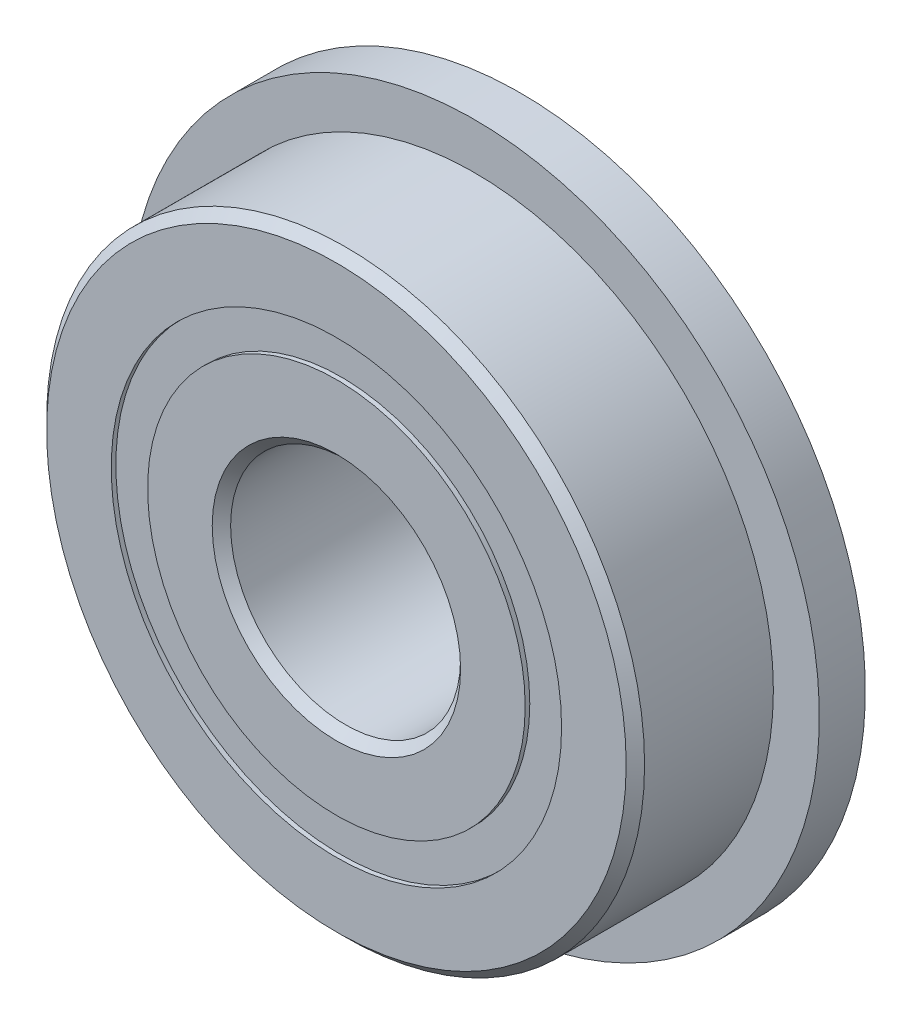
ISO-10303-21;
HEADER;
FILE_DESCRIPTION(('STEP AP214'),'2;1');
FILE_NAME('part.step','',(''),(''),'','','');
FILE_SCHEMA(('AUTOMOTIVE_DESIGN { 1 0 10303 214 1 1 1 1 }'));
ENDSEC;
DATA;
#1=APPLICATION_CONTEXT('core data for automotive mechanical design processes');
#2=APPLICATION_PROTOCOL_DEFINITION('international standard','automotive_design',2000,#1);
#3=PRODUCT_CONTEXT('',#1,'mechanical');
#4=PRODUCT('Part','Part','',(#3));
#5=PRODUCT_RELATED_PRODUCT_CATEGORY('part','',(#4));
#6=PRODUCT_DEFINITION_FORMATION('','',#4);
#7=PRODUCT_DEFINITION_CONTEXT('part definition',#1,'design');
#8=PRODUCT_DEFINITION('design','',#6,#7);
#9=PRODUCT_DEFINITION_SHAPE('','',#8);
#10=(LENGTH_UNIT() NAMED_UNIT(*) SI_UNIT(.MILLI.,.METRE.));
#11=(NAMED_UNIT(*) PLANE_ANGLE_UNIT() SI_UNIT($,.RADIAN.));
#12=(NAMED_UNIT(*) SI_UNIT($,.STERADIAN.) SOLID_ANGLE_UNIT());
#13=UNCERTAINTY_MEASURE_WITH_UNIT(LENGTH_MEASURE(1.E-05),#10,'distance_accuracy_value','');
#14=(GEOMETRIC_REPRESENTATION_CONTEXT(3) GLOBAL_UNCERTAINTY_ASSIGNED_CONTEXT((#13)) GLOBAL_UNIT_ASSIGNED_CONTEXT((#10,
#11,#12)) REPRESENTATION_CONTEXT('',''));
#15=CARTESIAN_POINT('',(0.,0.,0.));
#16=DIRECTION('',(0.,0.,1.));
#17=DIRECTION('',(1.,0.,0.));
#18=AXIS2_PLACEMENT_3D('',#15,#16,#17);
#19=CARTESIAN_POINT('',(0.,4.89560439560439,-1.9));
#20=DIRECTION('',(0.,0.,1.));
#21=DIRECTION('',(1.,0.,0.));
#22=AXIS2_PLACEMENT_3D('',#19,#20,#21);
#23=PLANE('',#22);
#24=CARTESIAN_POINT('',(0.,0.,-1.9));
#25=DIRECTION('',(0.,0.,1.));
#26=DIRECTION('',(1.,0.,0.));
#27=AXIS2_PLACEMENT_3D('',#24,#25,#26);
#28=CIRCLE('',#27,4.89560439560439);
#29=CARTESIAN_POINT('',(4.89560439560439,0.,-1.9));
#30=VERTEX_POINT('',#29);
#31=EDGE_CURVE('E57',#30,#30,#28,.T.);
#32=ORIENTED_EDGE('',*,*,#31,.F.);
#33=EDGE_LOOP('',(#32));
#34=FACE_BOUND('',#33,.T.);
#35=CARTESIAN_POINT('',(0.,0.,-1.9));
#36=DIRECTION('',(0.,0.,1.));
#37=DIRECTION('',(1.,0.,0.));
#38=AXIS2_PLACEMENT_3D('',#35,#36,#37);
#39=CIRCLE('',#38,4.1043956043956);
#40=CARTESIAN_POINT('',(4.1043956043956,0.,-1.9));
#41=VERTEX_POINT('',#40);
#42=EDGE_CURVE('E11',#41,#41,#39,.T.);
#43=ORIENTED_EDGE('',*,*,#42,.T.);
#44=EDGE_LOOP('',(#43));
#45=FACE_BOUND('',#44,.T.);
#46=ADVANCED_FACE('F43',(#34,#45),#23,.F.);
#47=CARTESIAN_POINT('',(0.,0.,2.));
#48=DIRECTION('',(0.,0.,1.));
#49=DIRECTION('',(1.,0.,0.));
#50=AXIS2_PLACEMENT_3D('',#47,#48,#49);
#51=CYLINDRICAL_SURFACE('',#50,4.1043956043956);
#52=ORIENTED_EDGE('',*,*,#42,.F.);
#53=EDGE_LOOP('',(#52));
#54=FACE_BOUND('',#53,.T.);
#55=CARTESIAN_POINT('',(0.,0.,-0.972947220876673));
#56=DIRECTION('',(0.,0.,1.));
#57=DIRECTION('',(1.,0.,0.));
#58=AXIS2_PLACEMENT_3D('',#55,#56,#57);
#59=CIRCLE('',#58,4.1043956043956);
#60=CARTESIAN_POINT('',(4.1043956043956,0.,-0.972947220876673));
#61=VERTEX_POINT('',#60);
#62=EDGE_CURVE('E49',#61,#61,#59,.T.);
#63=ORIENTED_EDGE('',*,*,#62,.T.);
#64=EDGE_LOOP('',(#63));
#65=FACE_BOUND('',#64,.T.);
#66=ADVANCED_FACE('F66',(#54,#65),#51,.F.);
#67=CARTESIAN_POINT('',(0.,4.8956043956044,-0.972947220876673));
#68=DIRECTION('',(0.,0.,-1.));
#69=DIRECTION('',(-1.,0.,0.));
#70=AXIS2_PLACEMENT_3D('',#67,#68,#69);
#71=PLANE('',#70);
#72=ORIENTED_EDGE('',*,*,#62,.F.);
#73=EDGE_LOOP('',(#72));
#74=FACE_BOUND('',#73,.T.);
#75=CARTESIAN_POINT('',(0.,0.,-0.972947220876673));
#76=DIRECTION('',(0.,0.,1.));
#77=DIRECTION('',(1.,0.,0.));
#78=AXIS2_PLACEMENT_3D('',#75,#76,#77);
#79=CIRCLE('',#78,4.8956043956044);
#80=CARTESIAN_POINT('',(4.8956043956044,0.,-0.972947220876673));
#81=VERTEX_POINT('',#80);
#82=EDGE_CURVE('E53',#81,#81,#79,.T.);
#83=ORIENTED_EDGE('',*,*,#82,.T.);
#84=EDGE_LOOP('',(#83));
#85=FACE_BOUND('',#84,.T.);
#86=ADVANCED_FACE('F70',(#74,#85),#71,.F.);
#87=CARTESIAN_POINT('',(0.,0.,2.));
#88=DIRECTION('',(0.,0.,1.));
#89=DIRECTION('',(1.,0.,0.));
#90=AXIS2_PLACEMENT_3D('',#87,#88,#89);
#91=CYLINDRICAL_SURFACE('',#90,4.89560439560439);
#92=ORIENTED_EDGE('',*,*,#82,.F.);
#93=EDGE_LOOP('',(#92));
#94=FACE_BOUND('',#93,.T.);
#95=ORIENTED_EDGE('',*,*,#31,.T.);
#96=EDGE_LOOP('',(#95));
#97=FACE_BOUND('',#96,.T.);
#98=ADVANCED_FACE('F63',(#94,#97),#91,.T.);
#99=CLOSED_SHELL('',(#46,#66,#86,#98));
#100=MANIFOLD_SOLID_BREP('B2',#99);
#101=CARTESIAN_POINT('',(0.,4.89560439560439,1.9));
#102=DIRECTION('',(0.,0.,-1.));
#103=DIRECTION('',(-1.,0.,0.));
#104=AXIS2_PLACEMENT_3D('',#101,#102,#103);
#105=PLANE('',#104);
#106=CARTESIAN_POINT('',(0.,0.,1.9));
#107=DIRECTION('',(0.,0.,1.));
#108=DIRECTION('',(1.,0.,0.));
#109=AXIS2_PLACEMENT_3D('',#106,#107,#108);
#110=CIRCLE('',#109,4.1043956043956);
#111=CARTESIAN_POINT('',(4.1043956043956,0.,1.9));
#112=VERTEX_POINT('',#111);
#113=EDGE_CURVE('E42',#112,#112,#110,.T.);
#114=ORIENTED_EDGE('',*,*,#113,.F.);
#115=EDGE_LOOP('',(#114));
#116=FACE_BOUND('',#115,.T.);
#117=CARTESIAN_POINT('',(0.,0.,1.9));
#118=DIRECTION('',(0.,0.,1.));
#119=DIRECTION('',(1.,0.,0.));
#120=AXIS2_PLACEMENT_3D('',#117,#118,#119);
#121=CIRCLE('',#120,4.89560439560439);
#122=CARTESIAN_POINT('',(4.89560439560439,0.,1.9));
#123=VERTEX_POINT('',#122);
#124=EDGE_CURVE('E126',#123,#123,#121,.T.);
#125=ORIENTED_EDGE('',*,*,#124,.T.);
#126=EDGE_LOOP('',(#125));
#127=FACE_BOUND('',#126,.T.);
#128=ADVANCED_FACE('F112',(#116,#127),#105,.F.);
#129=CARTESIAN_POINT('',(0.,0.,2.));
#130=DIRECTION('',(0.,0.,1.));
#131=DIRECTION('',(1.,0.,0.));
#132=AXIS2_PLACEMENT_3D('',#129,#130,#131);
#133=CYLINDRICAL_SURFACE('',#132,4.1043956043956);
#134=CARTESIAN_POINT('',(0.,0.,0.972947220876673));
#135=DIRECTION('',(0.,0.,1.));
#136=DIRECTION('',(1.,0.,0.));
#137=AXIS2_PLACEMENT_3D('',#134,#135,#136);
#138=CIRCLE('',#137,4.1043956043956);
#139=CARTESIAN_POINT('',(4.1043956043956,0.,0.972947220876673));
#140=VERTEX_POINT('',#139);
#141=EDGE_CURVE('E118',#140,#140,#138,.T.);
#142=ORIENTED_EDGE('',*,*,#141,.F.);
#143=EDGE_LOOP('',(#142));
#144=FACE_BOUND('',#143,.T.);
#145=ORIENTED_EDGE('',*,*,#113,.T.);
#146=EDGE_LOOP('',(#145));
#147=FACE_BOUND('',#146,.T.);
#148=ADVANCED_FACE('F141',(#144,#147),#133,.F.);
#149=CARTESIAN_POINT('',(0.,4.89560439560439,0.972947220876673));
#150=DIRECTION('',(0.,0.,1.));
#151=DIRECTION('',(1.,0.,0.));
#152=AXIS2_PLACEMENT_3D('',#149,#150,#151);
#153=PLANE('',#152);
#154=CARTESIAN_POINT('',(0.,0.,0.972947220876673));
#155=DIRECTION('',(0.,0.,1.));
#156=DIRECTION('',(1.,0.,0.));
#157=AXIS2_PLACEMENT_3D('',#154,#155,#156);
#158=CIRCLE('',#157,4.89560439560439);
#159=CARTESIAN_POINT('',(4.89560439560439,0.,0.972947220876673));
#160=VERTEX_POINT('',#159);
#161=EDGE_CURVE('E122',#160,#160,#158,.T.);
#162=ORIENTED_EDGE('',*,*,#161,.F.);
#163=EDGE_LOOP('',(#162));
#164=FACE_BOUND('',#163,.T.);
#165=ORIENTED_EDGE('',*,*,#141,.T.);
#166=EDGE_LOOP('',(#165));
#167=FACE_BOUND('',#166,.T.);
#168=ADVANCED_FACE('F136',(#164,#167),#153,.F.);
#169=CARTESIAN_POINT('',(0.,0.,2.));
#170=DIRECTION('',(0.,0.,1.));
#171=DIRECTION('',(1.,0.,0.));
#172=AXIS2_PLACEMENT_3D('',#169,#170,#171);
#173=CYLINDRICAL_SURFACE('',#172,4.89560439560439);
#174=ORIENTED_EDGE('',*,*,#124,.F.);
#175=EDGE_LOOP('',(#174));
#176=FACE_BOUND('',#175,.T.);
#177=ORIENTED_EDGE('',*,*,#161,.T.);
#178=EDGE_LOOP('',(#177));
#179=FACE_BOUND('',#178,.T.);
#180=ADVANCED_FACE('F133',(#176,#179),#173,.T.);
#181=CLOSED_SHELL('',(#128,#148,#168,#180));
#182=MANIFOLD_SOLID_BREP('B6',#181);
#183=CARTESIAN_POINT('',(0.,4.1043956043956,2.));
#184=DIRECTION('',(0.,0.,-1.));
#185=DIRECTION('',(-1.,0.,0.));
#186=AXIS2_PLACEMENT_3D('',#183,#184,#185);
#187=PLANE('',#186);
#188=CARTESIAN_POINT('',(0.,0.,2.));
#189=DIRECTION('',(0.,0.,1.));
#190=DIRECTION('',(1.,0.,0.));
#191=AXIS2_PLACEMENT_3D('',#188,#189,#190);
#192=CIRCLE('',#191,2.7);
#193=CARTESIAN_POINT('',(2.7,0.,2.));
#194=VERTEX_POINT('',#193);
#195=EDGE_CURVE('E208',#194,#194,#192,.T.);
#196=ORIENTED_EDGE('',*,*,#195,.F.);
#197=EDGE_LOOP('',(#196));
#198=FACE_BOUND('',#197,.T.);
#199=CARTESIAN_POINT('',(0.,0.,2.));
#200=DIRECTION('',(0.,0.,1.));
#201=DIRECTION('',(1.,0.,0.));
#202=AXIS2_PLACEMENT_3D('',#199,#200,#201);
#203=CIRCLE('',#202,4.1043956043956);
#204=CARTESIAN_POINT('',(4.1043956043956,0.,2.));
#205=VERTEX_POINT('',#204);
#206=EDGE_CURVE('E111',#205,#205,#203,.T.);
#207=ORIENTED_EDGE('',*,*,#206,.T.);
#208=EDGE_LOOP('',(#207));
#209=FACE_BOUND('',#208,.T.);
#210=ADVANCED_FACE('F180',(#198,#209),#187,.F.);
#211=CARTESIAN_POINT('',(0.,0.,2.));
#212=DIRECTION('',(0.,0.,1.));
#213=DIRECTION('',(1.,0.,0.));
#214=AXIS2_PLACEMENT_3D('',#211,#212,#213);
#215=CYLINDRICAL_SURFACE('',#214,4.1043956043956);
#216=ORIENTED_EDGE('',*,*,#206,.F.);
#217=EDGE_LOOP('',(#216));
#218=FACE_BOUND('',#217,.T.);
#219=CARTESIAN_POINT('',(0.,0.,0.888888888888888));
#220=DIRECTION('',(0.,0.,1.));
#221=DIRECTION('',(1.,0.,0.));
#222=AXIS2_PLACEMENT_3D('',#219,#220,#221);
#223=CIRCLE('',#222,4.1043956043956);
#224=CARTESIAN_POINT('',(4.1043956043956,0.,0.888888888888888));
#225=VERTEX_POINT('',#224);
#226=EDGE_CURVE('E186',#225,#225,#223,.T.);
#227=ORIENTED_EDGE('',*,*,#226,.T.);
#228=EDGE_LOOP('',(#227));
#229=FACE_BOUND('',#228,.T.);
#230=ADVANCED_FACE('F215',(#218,#229),#215,.T.);
#231=CARTESIAN_POINT('',(0.,0.,0.));
#232=DIRECTION('',(0.,0.,1.));
#233=DIRECTION('',(1.,0.,0.));
#234=AXIS2_PLACEMENT_3D('',#231,#232,#233);
#235=TOROIDAL_SURFACE('',#234,4.5,0.972947220876672);
#236=ORIENTED_EDGE('',*,*,#226,.F.);
#237=EDGE_LOOP('',(#236));
#238=FACE_BOUND('',#237,.T.);
#239=CARTESIAN_POINT('',(0.,0.,-0.88888888888889));
#240=DIRECTION('',(0.,0.,1.));
#241=DIRECTION('',(1.,0.,0.));
#242=AXIS2_PLACEMENT_3D('',#239,#240,#241);
#243=CIRCLE('',#242,4.1043956043956);
#244=CARTESIAN_POINT('',(4.1043956043956,0.,-0.88888888888889));
#245=VERTEX_POINT('',#244);
#246=EDGE_CURVE('E190',#245,#245,#243,.T.);
#247=ORIENTED_EDGE('',*,*,#246,.T.);
#248=EDGE_LOOP('',(#247));
#249=FACE_BOUND('',#248,.T.);
#250=ADVANCED_FACE('F219',(#238,#249),#235,.F.);
#251=CARTESIAN_POINT('',(0.,0.,2.));
#252=DIRECTION('',(0.,0.,1.));
#253=DIRECTION('',(1.,0.,0.));
#254=AXIS2_PLACEMENT_3D('',#251,#252,#253);
#255=CYLINDRICAL_SURFACE('',#254,4.1043956043956);
#256=ORIENTED_EDGE('',*,*,#246,.F.);
#257=EDGE_LOOP('',(#256));
#258=FACE_BOUND('',#257,.T.);
#259=CARTESIAN_POINT('',(0.,0.,-2.));
#260=DIRECTION('',(0.,0.,1.));
#261=DIRECTION('',(1.,0.,0.));
#262=AXIS2_PLACEMENT_3D('',#259,#260,#261);
#263=CIRCLE('',#262,4.1043956043956);
#264=CARTESIAN_POINT('',(4.1043956043956,0.,-2.));
#265=VERTEX_POINT('',#264);
#266=EDGE_CURVE('E194',#265,#265,#263,.T.);
#267=ORIENTED_EDGE('',*,*,#266,.T.);
#268=EDGE_LOOP('',(#267));
#269=FACE_BOUND('',#268,.T.);
#270=ADVANCED_FACE('F224',(#258,#269),#255,.T.);
#271=CARTESIAN_POINT('',(0.,2.7,-2.));
#272=DIRECTION('',(0.,0.,1.));
#273=DIRECTION('',(1.,0.,0.));
#274=AXIS2_PLACEMENT_3D('',#271,#272,#273);
#275=PLANE('',#274);
#276=ORIENTED_EDGE('',*,*,#266,.F.);
#277=EDGE_LOOP('',(#276));
#278=FACE_BOUND('',#277,.T.);
#279=CARTESIAN_POINT('',(0.,0.,-2.));
#280=DIRECTION('',(0.,0.,1.));
#281=DIRECTION('',(1.,0.,0.));
#282=AXIS2_PLACEMENT_3D('',#279,#280,#281);
#283=CIRCLE('',#282,2.7);
#284=CARTESIAN_POINT('',(2.7,0.,-2.));
#285=VERTEX_POINT('',#284);
#286=EDGE_CURVE('E199',#285,#285,#283,.T.);
#287=ORIENTED_EDGE('',*,*,#286,.T.);
#288=EDGE_LOOP('',(#287));
#289=FACE_BOUND('',#288,.T.);
#290=ADVANCED_FACE('F230',(#278,#289),#275,.F.);
#291=CARTESIAN_POINT('',(0.,0.,-1.8));
#292=DIRECTION('',(0.,0.,-1.));
#293=DIRECTION('',(-1.,0.,0.));
#294=AXIS2_PLACEMENT_3D('',#291,#292,#293);
#295=CONICAL_SURFACE('',#294,2.5,0.785398163397447);
#296=ORIENTED_EDGE('',*,*,#286,.F.);
#297=EDGE_LOOP('',(#296));
#298=FACE_BOUND('',#297,.T.);
#299=CARTESIAN_POINT('',(0.,0.,-1.8));
#300=DIRECTION('',(0.,0.,1.));
#301=DIRECTION('',(1.,0.,0.));
#302=AXIS2_PLACEMENT_3D('',#299,#300,#301);
#303=CIRCLE('',#302,2.5);
#304=CARTESIAN_POINT('',(2.5,0.,-1.8));
#305=VERTEX_POINT('',#304);
#306=EDGE_CURVE('E202',#305,#305,#303,.T.);
#307=ORIENTED_EDGE('',*,*,#306,.T.);
#308=EDGE_LOOP('',(#307));
#309=FACE_BOUND('',#308,.T.);
#310=ADVANCED_FACE('F234',(#298,#309),#295,.F.);
#311=CARTESIAN_POINT('',(0.,0.,2.));
#312=DIRECTION('',(0.,0.,1.));
#313=DIRECTION('',(1.,0.,0.));
#314=AXIS2_PLACEMENT_3D('',#311,#312,#313);
#315=CYLINDRICAL_SURFACE('',#314,2.5);
#316=ORIENTED_EDGE('',*,*,#306,.F.);
#317=EDGE_LOOP('',(#316));
#318=FACE_BOUND('',#317,.T.);
#319=CARTESIAN_POINT('',(0.,0.,1.8));
#320=DIRECTION('',(0.,0.,1.));
#321=DIRECTION('',(1.,0.,0.));
#322=AXIS2_PLACEMENT_3D('',#319,#320,#321);
#323=CIRCLE('',#322,2.5);
#324=CARTESIAN_POINT('',(2.5,0.,1.8));
#325=VERTEX_POINT('',#324);
#326=EDGE_CURVE('E205',#325,#325,#323,.T.);
#327=ORIENTED_EDGE('',*,*,#326,.T.);
#328=EDGE_LOOP('',(#327));
#329=FACE_BOUND('',#328,.T.);
#330=ADVANCED_FACE('F238',(#318,#329),#315,.F.);
#331=CARTESIAN_POINT('',(0.,0.,2.));
#332=DIRECTION('',(0.,0.,1.));
#333=DIRECTION('',(1.,0.,0.));
#334=AXIS2_PLACEMENT_3D('',#331,#332,#333);
#335=CONICAL_SURFACE('',#334,2.7,0.785398163397447);
#336=ORIENTED_EDGE('',*,*,#326,.F.);
#337=EDGE_LOOP('',(#336));
#338=FACE_BOUND('',#337,.T.);
#339=ORIENTED_EDGE('',*,*,#195,.T.);
#340=EDGE_LOOP('',(#339));
#341=FACE_BOUND('',#340,.T.);
#342=ADVANCED_FACE('F212',(#338,#341),#335,.F.);
#343=CLOSED_SHELL('',(#210,#230,#250,#270,#290,#310,#330,#342));
#344=MANIFOLD_SOLID_BREP('B37',#343);
#345=CARTESIAN_POINT('',(0.,0.,1.8));
#346=DIRECTION('',(0.,0.,-1.));
#347=DIRECTION('',(-1.,0.,0.));
#348=AXIS2_PLACEMENT_3D('',#345,#346,#347);
#349=CONICAL_SURFACE('',#348,6.5,0.785398163397448);
#350=CARTESIAN_POINT('',(0.,0.,2.));
#351=DIRECTION('',(0.,0.,1.));
#352=DIRECTION('',(1.,0.,0.));
#353=AXIS2_PLACEMENT_3D('',#350,#351,#352);
#354=CIRCLE('',#353,6.3);
#355=CARTESIAN_POINT('',(6.3,0.,2.));
#356=VERTEX_POINT('',#355);
#357=EDGE_CURVE('E323',#356,#356,#354,.T.);
#358=ORIENTED_EDGE('',*,*,#357,.F.);
#359=EDGE_LOOP('',(#358));
#360=FACE_BOUND('',#359,.T.);
#361=CARTESIAN_POINT('',(0.,0.,1.8));
#362=DIRECTION('',(0.,0.,1.));
#363=DIRECTION('',(1.,0.,0.));
#364=AXIS2_PLACEMENT_3D('',#361,#362,#363);
#365=CIRCLE('',#364,6.5);
#366=CARTESIAN_POINT('',(6.5,0.,1.8));
#367=VERTEX_POINT('',#366);
#368=EDGE_CURVE('E179',#367,#367,#365,.T.);
#369=ORIENTED_EDGE('',*,*,#368,.T.);
#370=EDGE_LOOP('',(#369));
#371=FACE_BOUND('',#370,.T.);
#372=ADVANCED_FACE('F301',(#360,#371),#349,.T.);
#373=CARTESIAN_POINT('',(0.,0.,2.));
#374=DIRECTION('',(0.,0.,1.));
#375=DIRECTION('',(1.,0.,0.));
#376=AXIS2_PLACEMENT_3D('',#373,#374,#375);
#377=CYLINDRICAL_SURFACE('',#376,6.5);
#378=CARTESIAN_POINT('',(0.,0.,-1.));
#379=DIRECTION('',(0.,0.,1.));
#380=DIRECTION('',(1.,0.,0.));
#381=AXIS2_PLACEMENT_3D('',#378,#379,#380);
#382=CIRCLE('',#381,6.5);
#383=CARTESIAN_POINT('',(6.5,0.,-1.));
#384=VERTEX_POINT('',#383);
#385=EDGE_CURVE('E326',#384,#384,#382,.T.);
#386=ORIENTED_EDGE('',*,*,#385,.T.);
#387=EDGE_LOOP('',(#386));
#388=FACE_BOUND('',#387,.T.);
#389=ORIENTED_EDGE('',*,*,#368,.F.);
#390=EDGE_LOOP('',(#389));
#391=FACE_BOUND('',#390,.T.);
#392=ADVANCED_FACE('F346',(#388,#391),#377,.T.);
#393=CARTESIAN_POINT('',(0.,6.3,-2.));
#394=DIRECTION('',(0.,0.,1.));
#395=DIRECTION('',(1.,0.,0.));
#396=AXIS2_PLACEMENT_3D('',#393,#394,#395);
#397=PLANE('',#396);
#398=CARTESIAN_POINT('',(0.,0.,-2.));
#399=DIRECTION('',(0.,0.,1.));
#400=DIRECTION('',(1.,0.,0.));
#401=AXIS2_PLACEMENT_3D('',#398,#399,#400);
#402=CIRCLE('',#401,4.8956043956044);
#403=CARTESIAN_POINT('',(4.8956043956044,0.,-2.));
#404=VERTEX_POINT('',#403);
#405=EDGE_CURVE('E307',#404,#404,#402,.T.);
#406=ORIENTED_EDGE('',*,*,#405,.T.);
#407=EDGE_LOOP('',(#406));
#408=FACE_BOUND('',#407,.T.);
#409=CARTESIAN_POINT('',(0.,0.,-2.));
#410=DIRECTION('',(0.,0.,-1.));
#411=DIRECTION('',(-1.,0.,0.));
#412=AXIS2_PLACEMENT_3D('',#409,#410,#411);
#413=CIRCLE('',#412,7.5);
#414=CARTESIAN_POINT('',(-7.5,0.,-2.));
#415=VERTEX_POINT('',#414);
#416=EDGE_CURVE('E329',#415,#415,#413,.T.);
#417=ORIENTED_EDGE('',*,*,#416,.T.);
#418=EDGE_LOOP('',(#417));
#419=FACE_BOUND('',#418,.T.);
#420=ADVANCED_FACE('F349',(#408,#419),#397,.F.);
#421=CARTESIAN_POINT('',(0.,0.,2.));
#422=DIRECTION('',(0.,0.,1.));
#423=DIRECTION('',(1.,0.,0.));
#424=AXIS2_PLACEMENT_3D('',#421,#422,#423);
#425=CYLINDRICAL_SURFACE('',#424,4.89560439560439);
#426=CARTESIAN_POINT('',(0.,0.,-0.888888888888889));
#427=DIRECTION('',(0.,0.,1.));
#428=DIRECTION('',(1.,0.,0.));
#429=AXIS2_PLACEMENT_3D('',#426,#427,#428);
#430=CIRCLE('',#429,4.89560439560439);
#431=CARTESIAN_POINT('',(4.89560439560439,0.,-0.888888888888889));
#432=VERTEX_POINT('',#431);
#433=EDGE_CURVE('E311',#432,#432,#430,.T.);
#434=ORIENTED_EDGE('',*,*,#433,.T.);
#435=EDGE_LOOP('',(#434));
#436=FACE_BOUND('',#435,.T.);
#437=ORIENTED_EDGE('',*,*,#405,.F.);
#438=EDGE_LOOP('',(#437));
#439=FACE_BOUND('',#438,.T.);
#440=ADVANCED_FACE('F354',(#436,#439),#425,.F.);
#441=CARTESIAN_POINT('',(0.,0.,0.));
#442=DIRECTION('',(0.,0.,1.));
#443=DIRECTION('',(1.,0.,0.));
#444=AXIS2_PLACEMENT_3D('',#441,#442,#443);
#445=TOROIDAL_SURFACE('',#444,4.5,0.972947220876673);
#446=ORIENTED_EDGE('',*,*,#433,.F.);
#447=EDGE_LOOP('',(#446));
#448=FACE_BOUND('',#447,.T.);
#449=CARTESIAN_POINT('',(0.,0.,0.888888888888888));
#450=DIRECTION('',(0.,0.,1.));
#451=DIRECTION('',(1.,0.,0.));
#452=AXIS2_PLACEMENT_3D('',#449,#450,#451);
#453=CIRCLE('',#452,4.89560439560439);
#454=CARTESIAN_POINT('',(4.89560439560439,0.,0.888888888888888));
#455=VERTEX_POINT('',#454);
#456=EDGE_CURVE('E315',#455,#455,#453,.T.);
#457=ORIENTED_EDGE('',*,*,#456,.T.);
#458=EDGE_LOOP('',(#457));
#459=FACE_BOUND('',#458,.T.);
#460=ADVANCED_FACE('F360',(#448,#459),#445,.F.);
#461=CARTESIAN_POINT('',(0.,0.,2.));
#462=DIRECTION('',(0.,0.,1.));
#463=DIRECTION('',(1.,0.,0.));
#464=AXIS2_PLACEMENT_3D('',#461,#462,#463);
#465=CYLINDRICAL_SURFACE('',#464,4.89560439560439);
#466=ORIENTED_EDGE('',*,*,#456,.F.);
#467=EDGE_LOOP('',(#466));
#468=FACE_BOUND('',#467,.T.);
#469=CARTESIAN_POINT('',(0.,0.,2.));
#470=DIRECTION('',(0.,0.,1.));
#471=DIRECTION('',(1.,0.,0.));
#472=AXIS2_PLACEMENT_3D('',#469,#470,#471);
#473=CIRCLE('',#472,4.89560439560439);
#474=CARTESIAN_POINT('',(4.89560439560439,0.,2.));
#475=VERTEX_POINT('',#474);
#476=EDGE_CURVE('E320',#475,#475,#473,.T.);
#477=ORIENTED_EDGE('',*,*,#476,.T.);
#478=EDGE_LOOP('',(#477));
#479=FACE_BOUND('',#478,.T.);
#480=ADVANCED_FACE('F364',(#468,#479),#465,.F.);
#481=CARTESIAN_POINT('',(0.,6.3,2.));
#482=DIRECTION('',(0.,0.,-1.));
#483=DIRECTION('',(-1.,0.,0.));
#484=AXIS2_PLACEMENT_3D('',#481,#482,#483);
#485=PLANE('',#484);
#486=ORIENTED_EDGE('',*,*,#476,.F.);
#487=EDGE_LOOP('',(#486));
#488=FACE_BOUND('',#487,.T.);
#489=ORIENTED_EDGE('',*,*,#357,.T.);
#490=EDGE_LOOP('',(#489));
#491=FACE_BOUND('',#490,.T.);
#492=ADVANCED_FACE('F342',(#488,#491),#485,.F.);
#493=CARTESIAN_POINT('',(0.,4.8956043956044,-1.));
#494=DIRECTION('',(0.,0.,1.));
#495=DIRECTION('',(1.,0.,0.));
#496=AXIS2_PLACEMENT_3D('',#493,#494,#495);
#497=PLANE('',#496);
#498=CARTESIAN_POINT('',(0.,0.,-1.));
#499=DIRECTION('',(0.,0.,-1.));
#500=DIRECTION('',(-1.,0.,0.));
#501=AXIS2_PLACEMENT_3D('',#498,#499,#500);
#502=CIRCLE('',#501,7.5);
#503=CARTESIAN_POINT('',(-7.5,0.,-1.));
#504=VERTEX_POINT('',#503);
#505=EDGE_CURVE('E332',#504,#504,#502,.T.);
#506=ORIENTED_EDGE('',*,*,#505,.F.);
#507=EDGE_LOOP('',(#506));
#508=FACE_BOUND('',#507,.T.);
#509=ORIENTED_EDGE('',*,*,#385,.F.);
#510=EDGE_LOOP('',(#509));
#511=FACE_BOUND('',#510,.T.);
#512=ADVANCED_FACE('F339',(#508,#511),#497,.T.);
#513=CARTESIAN_POINT('',(0.,0.,-2.));
#514=DIRECTION('',(0.,0.,-1.));
#515=DIRECTION('',(-1.,0.,0.));
#516=AXIS2_PLACEMENT_3D('',#513,#514,#515);
#517=CYLINDRICAL_SURFACE('',#516,7.5);
#518=ORIENTED_EDGE('',*,*,#505,.T.);
#519=EDGE_LOOP('',(#518));
#520=FACE_BOUND('',#519,.T.);
#521=ORIENTED_EDGE('',*,*,#416,.F.);
#522=EDGE_LOOP('',(#521));
#523=FACE_BOUND('',#522,.T.);
#524=ADVANCED_FACE('F336',(#520,#523),#517,.T.);
#525=CLOSED_SHELL('',(#372,#392,#420,#440,#460,#480,#492,#512,#524));
#526=MANIFOLD_SOLID_BREP('B106',#525);
#527=ADVANCED_BREP_SHAPE_REPRESENTATION('',(#18,#100,#182,#344,#526),#14);
#528=SHAPE_DEFINITION_REPRESENTATION(#9,#527);
ENDSEC;
END-ISO-10303-21;
